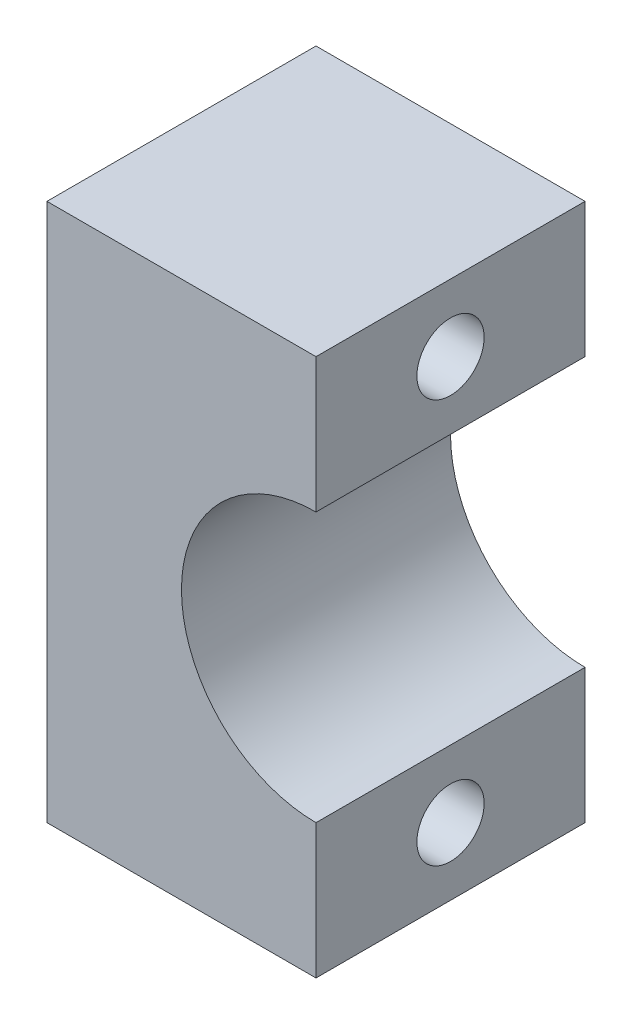
ISO-10303-21;
HEADER;
FILE_DESCRIPTION(('STEP AP214'),'2;1');
FILE_NAME('part.step','',(''),(''),'','','');
FILE_SCHEMA(('AUTOMOTIVE_DESIGN { 1 0 10303 214 1 1 1 1 }'));
ENDSEC;
DATA;
#1=APPLICATION_CONTEXT('core data for automotive mechanical design processes');
#2=APPLICATION_PROTOCOL_DEFINITION('international standard','automotive_design',2000,#1);
#3=PRODUCT_CONTEXT('',#1,'mechanical');
#4=PRODUCT('Part','Part','',(#3));
#5=PRODUCT_RELATED_PRODUCT_CATEGORY('part','',(#4));
#6=PRODUCT_DEFINITION_FORMATION('','',#4);
#7=PRODUCT_DEFINITION_CONTEXT('part definition',#1,'design');
#8=PRODUCT_DEFINITION('design','',#6,#7);
#9=PRODUCT_DEFINITION_SHAPE('','',#8);
#10=(LENGTH_UNIT() NAMED_UNIT(*) SI_UNIT(.MILLI.,.METRE.));
#11=(NAMED_UNIT(*) PLANE_ANGLE_UNIT() SI_UNIT($,.RADIAN.));
#12=(NAMED_UNIT(*) SI_UNIT($,.STERADIAN.) SOLID_ANGLE_UNIT());
#13=UNCERTAINTY_MEASURE_WITH_UNIT(LENGTH_MEASURE(1.E-05),#10,'distance_accuracy_value','');
#14=(GEOMETRIC_REPRESENTATION_CONTEXT(3) GLOBAL_UNCERTAINTY_ASSIGNED_CONTEXT((#13)) GLOBAL_UNIT_ASSIGNED_CONTEXT((#10,
#11,#12)) REPRESENTATION_CONTEXT('',''));
#15=CARTESIAN_POINT('',(0.,0.,0.));
#16=DIRECTION('',(0.,0.,1.));
#17=DIRECTION('',(1.,0.,0.));
#18=AXIS2_PLACEMENT_3D('',#15,#16,#17);
#19=CARTESIAN_POINT('',(-20.,20.,20.));
#20=DIRECTION('',(1.,0.,0.));
#21=DIRECTION('',(0.,0.,-1.));
#22=AXIS2_PLACEMENT_3D('',#19,#20,#21);
#23=PLANE('',#22);
#24=DIRECTION('',(0.,-1.,0.));
#25=VECTOR('',#24,1.);
#26=CARTESIAN_POINT('',(-20.,20.,0.));
#27=LINE('',#26,#25);
#28=CARTESIAN_POINT('',(-20.,20.,0.));
#29=VERTEX_POINT('',#28);
#30=CARTESIAN_POINT('',(-20.,-20.,0.));
#31=VERTEX_POINT('',#30);
#32=EDGE_CURVE('E127',#29,#31,#27,.T.);
#33=ORIENTED_EDGE('',*,*,#32,.T.);
#34=DIRECTION('',(0.,0.,-1.));
#35=VECTOR('',#34,1.);
#36=CARTESIAN_POINT('',(-20.,-20.,20.));
#37=LINE('',#36,#35);
#38=CARTESIAN_POINT('',(-20.,-20.,20.));
#39=VERTEX_POINT('',#38);
#40=EDGE_CURVE('E124',#39,#31,#37,.T.);
#41=ORIENTED_EDGE('',*,*,#40,.F.);
#42=DIRECTION('',(0.,-1.,0.));
#43=VECTOR('',#42,1.);
#44=CARTESIAN_POINT('',(-20.,20.,20.));
#45=LINE('',#44,#43);
#46=CARTESIAN_POINT('',(-20.,20.,20.));
#47=VERTEX_POINT('',#46);
#48=EDGE_CURVE('E110',#47,#39,#45,.T.);
#49=ORIENTED_EDGE('',*,*,#48,.F.);
#50=DIRECTION('',(0.,0.,-1.));
#51=VECTOR('',#50,1.);
#52=CARTESIAN_POINT('',(-20.,20.,20.));
#53=LINE('',#52,#51);
#54=EDGE_CURVE('E131',#47,#29,#53,.T.);
#55=ORIENTED_EDGE('',*,*,#54,.T.);
#56=EDGE_LOOP('',(#33,#41,#49,#55));
#57=FACE_BOUND('',#56,.T.);
#58=CARTESIAN_POINT('',(-20.,-15.,10.));
#59=DIRECTION('',(1.,0.,0.));
#60=DIRECTION('',(0.,0.,-1.));
#61=AXIS2_PLACEMENT_3D('',#58,#59,#60);
#62=CIRCLE('',#61,2.5);
#63=CARTESIAN_POINT('',(-20.,-15.,7.5));
#64=VERTEX_POINT('',#63);
#65=EDGE_CURVE('E189',#64,#64,#62,.T.);
#66=ORIENTED_EDGE('',*,*,#65,.T.);
#67=EDGE_LOOP('',(#66));
#68=FACE_BOUND('',#67,.T.);
#69=CARTESIAN_POINT('',(-20.,15.,10.));
#70=DIRECTION('',(1.,0.,0.));
#71=DIRECTION('',(0.,0.,-1.));
#72=AXIS2_PLACEMENT_3D('',#69,#70,#71);
#73=CIRCLE('',#72,2.5);
#74=CARTESIAN_POINT('',(-20.,15.,7.5));
#75=VERTEX_POINT('',#74);
#76=EDGE_CURVE('E147',#75,#75,#73,.T.);
#77=ORIENTED_EDGE('',*,*,#76,.T.);
#78=EDGE_LOOP('',(#77));
#79=FACE_BOUND('',#78,.T.);
#80=DIRECTION('',(0.,-1.,0.));
#81=VECTOR('',#80,1.);
#82=CARTESIAN_POINT('',(-20.,6.01054794666512,13.2604910584538));
#83=LINE('',#82,#81);
#84=CARTESIAN_POINT('',(-20.,6.01054794666512,13.2604910584538));
#85=VERTEX_POINT('',#84);
#86=CARTESIAN_POINT('',(-20.,-6.01054794666512,13.2604910584538));
#87=VERTEX_POINT('',#86);
#88=EDGE_CURVE('E56',#85,#87,#83,.T.);
#89=ORIENTED_EDGE('',*,*,#88,.T.);
#90=DIRECTION('',(0.,0.,-1.));
#91=VECTOR('',#90,1.);
#92=CARTESIAN_POINT('',(-20.,-6.01054794666512,6.73950894154617));
#93=LINE('',#92,#91);
#94=CARTESIAN_POINT('',(-20.,-6.01054794666512,6.73950894154617));
#95=VERTEX_POINT('',#94);
#96=EDGE_CURVE('E224',#87,#95,#93,.T.);
#97=ORIENTED_EDGE('',*,*,#96,.T.);
#98=DIRECTION('',(0.,1.,0.));
#99=VECTOR('',#98,1.);
#100=CARTESIAN_POINT('',(-20.,6.01054794666512,6.73950894154617));
#101=LINE('',#100,#99);
#102=CARTESIAN_POINT('',(-20.,6.01054794666512,6.73950894154617));
#103=VERTEX_POINT('',#102);
#104=EDGE_CURVE('E220',#95,#103,#101,.T.);
#105=ORIENTED_EDGE('',*,*,#104,.T.);
#106=DIRECTION('',(0.,0.,1.));
#107=VECTOR('',#106,1.);
#108=CARTESIAN_POINT('',(-20.,6.01054794666512,6.73950894154617));
#109=LINE('',#108,#107);
#110=EDGE_CURVE('E215',#103,#85,#109,.T.);
#111=ORIENTED_EDGE('',*,*,#110,.T.);
#112=EDGE_LOOP('',(#89,#97,#105,#111));
#113=FACE_BOUND('',#112,.T.);
#114=ADVANCED_FACE('F39',(#57,#68,#79,#113),#23,.F.);
#115=CARTESIAN_POINT('',(0.,0.,20.));
#116=DIRECTION('',(0.,0.,-1.));
#117=DIRECTION('',(-1.,0.,0.));
#118=AXIS2_PLACEMENT_3D('',#115,#116,#117);
#119=CYLINDRICAL_SURFACE('',#118,10.);
#120=CARTESIAN_POINT('',(0.,0.,0.));
#121=DIRECTION('',(0.,0.,-1.));
#122=DIRECTION('',(1.,0.,0.));
#123=AXIS2_PLACEMENT_3D('',#120,#121,#122);
#124=CIRCLE('',#123,10.);
#125=CARTESIAN_POINT('',(0.,-10.,0.));
#126=VERTEX_POINT('',#125);
#127=CARTESIAN_POINT('',(0.,10.,0.));
#128=VERTEX_POINT('',#127);
#129=EDGE_CURVE('E142',#126,#128,#124,.T.);
#130=ORIENTED_EDGE('',*,*,#129,.T.);
#131=DIRECTION('',(0.,0.,-1.));
#132=VECTOR('',#131,1.);
#133=CARTESIAN_POINT('',(0.,10.,20.));
#134=LINE('',#133,#132);
#135=CARTESIAN_POINT('',(0.,10.,20.));
#136=VERTEX_POINT('',#135);
#137=EDGE_CURVE('E11',#136,#128,#134,.T.);
#138=ORIENTED_EDGE('',*,*,#137,.F.);
#139=CARTESIAN_POINT('',(0.,0.,20.));
#140=DIRECTION('',(0.,0.,-1.));
#141=DIRECTION('',(1.,0.,0.));
#142=AXIS2_PLACEMENT_3D('',#139,#140,#141);
#143=CIRCLE('',#142,10.);
#144=CARTESIAN_POINT('',(0.,-10.,20.));
#145=VERTEX_POINT('',#144);
#146=EDGE_CURVE('E160',#145,#136,#143,.T.);
#147=ORIENTED_EDGE('',*,*,#146,.F.);
#148=DIRECTION('',(0.,0.,-1.));
#149=VECTOR('',#148,1.);
#150=CARTESIAN_POINT('',(0.,-10.,20.));
#151=LINE('',#150,#149);
#152=EDGE_CURVE('E138',#145,#126,#151,.T.);
#153=ORIENTED_EDGE('',*,*,#152,.T.);
#154=EDGE_LOOP('',(#130,#138,#147,#153));
#155=FACE_BOUND('',#154,.T.);
#156=ADVANCED_FACE('F41',(#155),#119,.F.);
#157=CARTESIAN_POINT('',(0.,20.,20.));
#158=DIRECTION('',(-1.,0.,0.));
#159=DIRECTION('',(0.,0.,1.));
#160=AXIS2_PLACEMENT_3D('',#157,#158,#159);
#161=PLANE('',#160);
#162=CARTESIAN_POINT('',(0.,15.,10.));
#163=DIRECTION('',(1.,0.,0.));
#164=DIRECTION('',(0.,0.,-1.));
#165=AXIS2_PLACEMENT_3D('',#162,#163,#164);
#166=CIRCLE('',#165,2.5);
#167=CARTESIAN_POINT('',(0.,15.,7.5));
#168=VERTEX_POINT('',#167);
#169=EDGE_CURVE('E194',#168,#168,#166,.T.);
#170=ORIENTED_EDGE('',*,*,#169,.F.);
#171=EDGE_LOOP('',(#170));
#172=FACE_BOUND('',#171,.T.);
#173=DIRECTION('',(0.,1.,0.));
#174=VECTOR('',#173,1.);
#175=CARTESIAN_POINT('',(0.,20.,0.));
#176=LINE('',#175,#174);
#177=CARTESIAN_POINT('',(0.,20.,0.));
#178=VERTEX_POINT('',#177);
#179=EDGE_CURVE('E146',#128,#178,#176,.T.);
#180=ORIENTED_EDGE('',*,*,#179,.T.);
#181=DIRECTION('',(0.,0.,-1.));
#182=VECTOR('',#181,1.);
#183=CARTESIAN_POINT('',(0.,20.,20.));
#184=LINE('',#183,#182);
#185=CARTESIAN_POINT('',(0.,20.,20.));
#186=VERTEX_POINT('',#185);
#187=EDGE_CURVE('E49',#186,#178,#184,.T.);
#188=ORIENTED_EDGE('',*,*,#187,.F.);
#189=DIRECTION('',(0.,1.,0.));
#190=VECTOR('',#189,1.);
#191=CARTESIAN_POINT('',(0.,20.,20.));
#192=LINE('',#191,#190);
#193=EDGE_CURVE('E100',#136,#186,#192,.T.);
#194=ORIENTED_EDGE('',*,*,#193,.F.);
#195=ORIENTED_EDGE('',*,*,#137,.T.);
#196=EDGE_LOOP('',(#180,#188,#194,#195));
#197=FACE_BOUND('',#196,.T.);
#198=ADVANCED_FACE('F272',(#172,#197),#161,.F.);
#199=CARTESIAN_POINT('',(-20.,20.,20.));
#200=DIRECTION('',(0.,-1.,0.));
#201=DIRECTION('',(0.,0.,-1.));
#202=AXIS2_PLACEMENT_3D('',#199,#200,#201);
#203=PLANE('',#202);
#204=DIRECTION('',(-1.,0.,0.));
#205=VECTOR('',#204,1.);
#206=CARTESIAN_POINT('',(-20.,20.,0.));
#207=LINE('',#206,#205);
#208=EDGE_CURVE('E150',#178,#29,#207,.T.);
#209=ORIENTED_EDGE('',*,*,#208,.T.);
#210=ORIENTED_EDGE('',*,*,#54,.F.);
#211=DIRECTION('',(-1.,0.,0.));
#212=VECTOR('',#211,1.);
#213=CARTESIAN_POINT('',(-20.,20.,20.));
#214=LINE('',#213,#212);
#215=EDGE_CURVE('E117',#186,#47,#214,.T.);
#216=ORIENTED_EDGE('',*,*,#215,.F.);
#217=ORIENTED_EDGE('',*,*,#187,.T.);
#218=EDGE_LOOP('',(#209,#210,#216,#217));
#219=FACE_BOUND('',#218,.T.);
#220=ADVANCED_FACE('F171',(#219),#203,.F.);
#221=CARTESIAN_POINT('',(-20.,-20.,20.));
#222=DIRECTION('',(0.,1.,0.));
#223=DIRECTION('',(0.,0.,1.));
#224=AXIS2_PLACEMENT_3D('',#221,#222,#223);
#225=PLANE('',#224);
#226=DIRECTION('',(1.,0.,0.));
#227=VECTOR('',#226,1.);
#228=CARTESIAN_POINT('',(-20.,-20.,0.));
#229=LINE('',#228,#227);
#230=CARTESIAN_POINT('',(0.,-20.,0.));
#231=VERTEX_POINT('',#230);
#232=EDGE_CURVE('E155',#31,#231,#229,.T.);
#233=ORIENTED_EDGE('',*,*,#232,.T.);
#234=DIRECTION('',(0.,0.,-1.));
#235=VECTOR('',#234,1.);
#236=CARTESIAN_POINT('',(0.,-20.,20.));
#237=LINE('',#236,#235);
#238=CARTESIAN_POINT('',(0.,-20.,20.));
#239=VERTEX_POINT('',#238);
#240=EDGE_CURVE('E132',#239,#231,#237,.T.);
#241=ORIENTED_EDGE('',*,*,#240,.F.);
#242=DIRECTION('',(1.,0.,0.));
#243=VECTOR('',#242,1.);
#244=CARTESIAN_POINT('',(-20.,-20.,20.));
#245=LINE('',#244,#243);
#246=EDGE_CURVE('E114',#39,#239,#245,.T.);
#247=ORIENTED_EDGE('',*,*,#246,.F.);
#248=ORIENTED_EDGE('',*,*,#40,.T.);
#249=EDGE_LOOP('',(#233,#241,#247,#248));
#250=FACE_BOUND('',#249,.T.);
#251=ADVANCED_FACE('F134',(#250),#225,.F.);
#252=CARTESIAN_POINT('',(0.,-10.,20.));
#253=DIRECTION('',(-1.,0.,0.));
#254=DIRECTION('',(0.,0.,1.));
#255=AXIS2_PLACEMENT_3D('',#252,#253,#254);
#256=PLANE('',#255);
#257=CARTESIAN_POINT('',(0.,-15.,10.));
#258=DIRECTION('',(1.,0.,0.));
#259=DIRECTION('',(0.,0.,-1.));
#260=AXIS2_PLACEMENT_3D('',#257,#258,#259);
#261=CIRCLE('',#260,2.5);
#262=CARTESIAN_POINT('',(0.,-15.,7.5));
#263=VERTEX_POINT('',#262);
#264=EDGE_CURVE('E184',#263,#263,#261,.T.);
#265=ORIENTED_EDGE('',*,*,#264,.F.);
#266=EDGE_LOOP('',(#265));
#267=FACE_BOUND('',#266,.T.);
#268=DIRECTION('',(0.,1.,0.));
#269=VECTOR('',#268,1.);
#270=CARTESIAN_POINT('',(0.,-10.,0.));
#271=LINE('',#270,#269);
#272=EDGE_CURVE('E92',#231,#126,#271,.T.);
#273=ORIENTED_EDGE('',*,*,#272,.T.);
#274=ORIENTED_EDGE('',*,*,#152,.F.);
#275=DIRECTION('',(0.,1.,0.));
#276=VECTOR('',#275,1.);
#277=CARTESIAN_POINT('',(0.,-10.,20.));
#278=LINE('',#277,#276);
#279=EDGE_CURVE('E65',#239,#145,#278,.T.);
#280=ORIENTED_EDGE('',*,*,#279,.F.);
#281=ORIENTED_EDGE('',*,*,#240,.T.);
#282=EDGE_LOOP('',(#273,#274,#280,#281));
#283=FACE_BOUND('',#282,.T.);
#284=ADVANCED_FACE('F175',(#267,#283),#256,.F.);
#285=CARTESIAN_POINT('',(0.,0.,20.));
#286=DIRECTION('',(0.,0.,1.));
#287=DIRECTION('',(1.,0.,0.));
#288=AXIS2_PLACEMENT_3D('',#285,#286,#287);
#289=PLANE('',#288);
#290=ORIENTED_EDGE('',*,*,#146,.T.);
#291=ORIENTED_EDGE('',*,*,#193,.T.);
#292=ORIENTED_EDGE('',*,*,#215,.T.);
#293=ORIENTED_EDGE('',*,*,#48,.T.);
#294=ORIENTED_EDGE('',*,*,#246,.T.);
#295=ORIENTED_EDGE('',*,*,#279,.T.);
#296=EDGE_LOOP('',(#290,#291,#292,#293,#294,#295));
#297=FACE_BOUND('',#296,.T.);
#298=ADVANCED_FACE('F112',(#297),#289,.T.);
#299=CARTESIAN_POINT('',(0.,0.,0.));
#300=DIRECTION('',(0.,0.,1.));
#301=DIRECTION('',(1.,0.,0.));
#302=AXIS2_PLACEMENT_3D('',#299,#300,#301);
#303=PLANE('',#302);
#304=CARTESIAN_POINT('',(-16.577606786142,0.,0.));
#305=DIRECTION('',(0.,0.,1.));
#306=DIRECTION('',(1.,0.,0.));
#307=AXIS2_PLACEMENT_3D('',#304,#305,#306);
#308=CIRCLE('',#307,1.);
#309=CARTESIAN_POINT('',(-15.577606786142,0.,0.));
#310=VERTEX_POINT('',#309);
#311=EDGE_CURVE('E244',#310,#310,#308,.T.);
#312=ORIENTED_EDGE('',*,*,#311,.T.);
#313=EDGE_LOOP('',(#312));
#314=FACE_BOUND('',#313,.T.);
#315=ORIENTED_EDGE('',*,*,#129,.F.);
#316=ORIENTED_EDGE('',*,*,#272,.F.);
#317=ORIENTED_EDGE('',*,*,#232,.F.);
#318=ORIENTED_EDGE('',*,*,#32,.F.);
#319=ORIENTED_EDGE('',*,*,#208,.F.);
#320=ORIENTED_EDGE('',*,*,#179,.F.);
#321=EDGE_LOOP('',(#315,#316,#317,#318,#319,#320));
#322=FACE_BOUND('',#321,.T.);
#323=ADVANCED_FACE('F174',(#314,#322),#303,.F.);
#324=CARTESIAN_POINT('',(-20.,-15.,10.));
#325=DIRECTION('',(1.,0.,0.));
#326=DIRECTION('',(0.,0.,-1.));
#327=AXIS2_PLACEMENT_3D('',#324,#325,#326);
#328=CYLINDRICAL_SURFACE('',#327,2.5);
#329=ORIENTED_EDGE('',*,*,#65,.F.);
#330=EDGE_LOOP('',(#329));
#331=FACE_BOUND('',#330,.T.);
#332=ORIENTED_EDGE('',*,*,#264,.T.);
#333=EDGE_LOOP('',(#332));
#334=FACE_BOUND('',#333,.T.);
#335=ADVANCED_FACE('F286',(#331,#334),#328,.F.);
#336=CARTESIAN_POINT('',(-20.,15.,10.));
#337=DIRECTION('',(1.,0.,0.));
#338=DIRECTION('',(0.,0.,-1.));
#339=AXIS2_PLACEMENT_3D('',#336,#337,#338);
#340=CYLINDRICAL_SURFACE('',#339,2.5);
#341=ORIENTED_EDGE('',*,*,#76,.F.);
#342=EDGE_LOOP('',(#341));
#343=FACE_BOUND('',#342,.T.);
#344=ORIENTED_EDGE('',*,*,#169,.T.);
#345=EDGE_LOOP('',(#344));
#346=FACE_BOUND('',#345,.T.);
#347=ADVANCED_FACE('F283',(#343,#346),#340,.F.);
#348=CARTESIAN_POINT('',(-15.,6.01054794666512,13.2604910584538));
#349=DIRECTION('',(0.,0.,-1.));
#350=DIRECTION('',(-1.,0.,0.));
#351=AXIS2_PLACEMENT_3D('',#348,#349,#350);
#352=PLANE('',#351);
#353=ORIENTED_EDGE('',*,*,#88,.F.);
#354=DIRECTION('',(-1.,0.,0.));
#355=VECTOR('',#354,1.);
#356=CARTESIAN_POINT('',(-15.,6.01054794666512,13.2604910584538));
#357=LINE('',#356,#355);
#358=CARTESIAN_POINT('',(-15.,6.01054794666512,13.2604910584538));
#359=VERTEX_POINT('',#358);
#360=EDGE_CURVE('E211',#359,#85,#357,.T.);
#361=ORIENTED_EDGE('',*,*,#360,.F.);
#362=DIRECTION('',(0.,-1.,0.));
#363=VECTOR('',#362,1.);
#364=CARTESIAN_POINT('',(-15.,6.01054794666512,13.2604910584538));
#365=LINE('',#364,#363);
#366=CARTESIAN_POINT('',(-15.,-6.01054794666512,13.2604910584538));
#367=VERTEX_POINT('',#366);
#368=EDGE_CURVE('E219',#359,#367,#365,.T.);
#369=ORIENTED_EDGE('',*,*,#368,.T.);
#370=DIRECTION('',(-1.,0.,0.));
#371=VECTOR('',#370,1.);
#372=CARTESIAN_POINT('',(-15.,-6.01054794666512,13.2604910584538));
#373=LINE('',#372,#371);
#374=EDGE_CURVE('E190',#367,#87,#373,.T.);
#375=ORIENTED_EDGE('',*,*,#374,.T.);
#376=EDGE_LOOP('',(#353,#361,#369,#375));
#377=FACE_BOUND('',#376,.T.);
#378=ADVANCED_FACE('F285',(#377),#352,.T.);
#379=CARTESIAN_POINT('',(-15.,-6.01054794666512,6.73950894154617));
#380=DIRECTION('',(0.,1.,0.));
#381=DIRECTION('',(0.,0.,1.));
#382=AXIS2_PLACEMENT_3D('',#379,#380,#381);
#383=PLANE('',#382);
#384=ORIENTED_EDGE('',*,*,#96,.F.);
#385=ORIENTED_EDGE('',*,*,#374,.F.);
#386=DIRECTION('',(0.,0.,-1.));
#387=VECTOR('',#386,1.);
#388=CARTESIAN_POINT('',(-15.,-6.01054794666512,6.73950894154617));
#389=LINE('',#388,#387);
#390=CARTESIAN_POINT('',(-15.,-6.01054794666512,6.73950894154617));
#391=VERTEX_POINT('',#390);
#392=EDGE_CURVE('E237',#367,#391,#389,.T.);
#393=ORIENTED_EDGE('',*,*,#392,.T.);
#394=DIRECTION('',(-1.,0.,0.));
#395=VECTOR('',#394,1.);
#396=CARTESIAN_POINT('',(-15.,-6.01054794666512,6.73950894154617));
#397=LINE('',#396,#395);
#398=EDGE_CURVE('E203',#391,#95,#397,.T.);
#399=ORIENTED_EDGE('',*,*,#398,.T.);
#400=EDGE_LOOP('',(#384,#385,#393,#399));
#401=FACE_BOUND('',#400,.T.);
#402=ADVANCED_FACE('F293',(#401),#383,.T.);
#403=CARTESIAN_POINT('',(-15.,6.01054794666512,6.73950894154617));
#404=DIRECTION('',(0.,0.,1.));
#405=DIRECTION('',(1.,0.,0.));
#406=AXIS2_PLACEMENT_3D('',#403,#404,#405);
#407=PLANE('',#406);
#408=CARTESIAN_POINT('',(-16.577606786142,0.,6.73950894154617));
#409=DIRECTION('',(0.,0.,1.));
#410=DIRECTION('',(1.,0.,0.));
#411=AXIS2_PLACEMENT_3D('',#408,#409,#410);
#412=CIRCLE('',#411,1.);
#413=CARTESIAN_POINT('',(-15.577606786142,0.,6.73950894154617));
#414=VERTEX_POINT('',#413);
#415=EDGE_CURVE('E43',#414,#414,#412,.F.);
#416=ORIENTED_EDGE('',*,*,#415,.T.);
#417=EDGE_LOOP('',(#416));
#418=FACE_BOUND('',#417,.T.);
#419=ORIENTED_EDGE('',*,*,#104,.F.);
#420=ORIENTED_EDGE('',*,*,#398,.F.);
#421=DIRECTION('',(0.,1.,0.));
#422=VECTOR('',#421,1.);
#423=CARTESIAN_POINT('',(-15.,6.01054794666512,6.73950894154617));
#424=LINE('',#423,#422);
#425=CARTESIAN_POINT('',(-15.,6.01054794666512,6.73950894154617));
#426=VERTEX_POINT('',#425);
#427=EDGE_CURVE('E233',#391,#426,#424,.T.);
#428=ORIENTED_EDGE('',*,*,#427,.T.);
#429=DIRECTION('',(-1.,0.,0.));
#430=VECTOR('',#429,1.);
#431=CARTESIAN_POINT('',(-15.,6.01054794666512,6.73950894154617));
#432=LINE('',#431,#430);
#433=EDGE_CURVE('E207',#426,#103,#432,.T.);
#434=ORIENTED_EDGE('',*,*,#433,.T.);
#435=EDGE_LOOP('',(#419,#420,#428,#434));
#436=FACE_BOUND('',#435,.T.);
#437=ADVANCED_FACE('F253',(#418,#436),#407,.T.);
#438=CARTESIAN_POINT('',(-15.,6.01054794666512,6.73950894154617));
#439=DIRECTION('',(0.,-1.,0.));
#440=DIRECTION('',(0.,0.,-1.));
#441=AXIS2_PLACEMENT_3D('',#438,#439,#440);
#442=PLANE('',#441);
#443=ORIENTED_EDGE('',*,*,#110,.F.);
#444=ORIENTED_EDGE('',*,*,#433,.F.);
#445=DIRECTION('',(0.,0.,1.));
#446=VECTOR('',#445,1.);
#447=CARTESIAN_POINT('',(-15.,6.01054794666512,6.73950894154617));
#448=LINE('',#447,#446);
#449=EDGE_CURVE('E214',#426,#359,#448,.T.);
#450=ORIENTED_EDGE('',*,*,#449,.T.);
#451=ORIENTED_EDGE('',*,*,#360,.T.);
#452=EDGE_LOOP('',(#443,#444,#450,#451));
#453=FACE_BOUND('',#452,.T.);
#454=ADVANCED_FACE('F264',(#453),#442,.T.);
#455=CARTESIAN_POINT('',(-15.,0.,0.));
#456=DIRECTION('',(-1.,0.,0.));
#457=DIRECTION('',(0.,0.,1.));
#458=AXIS2_PLACEMENT_3D('',#455,#456,#457);
#459=PLANE('',#458);
#460=ORIENTED_EDGE('',*,*,#368,.F.);
#461=ORIENTED_EDGE('',*,*,#449,.F.);
#462=ORIENTED_EDGE('',*,*,#427,.F.);
#463=ORIENTED_EDGE('',*,*,#392,.F.);
#464=EDGE_LOOP('',(#460,#461,#462,#463));
#465=FACE_BOUND('',#464,.T.);
#466=ADVANCED_FACE('F259',(#465),#459,.T.);
#467=CARTESIAN_POINT('',(-16.577606786142,0.,7.));
#468=DIRECTION('',(0.,0.,-1.));
#469=DIRECTION('',(-1.,0.,0.));
#470=AXIS2_PLACEMENT_3D('',#467,#468,#469);
#471=CYLINDRICAL_SURFACE('',#470,1.);
#472=ORIENTED_EDGE('',*,*,#415,.F.);
#473=EDGE_LOOP('',(#472));
#474=FACE_BOUND('',#473,.T.);
#475=ORIENTED_EDGE('',*,*,#311,.F.);
#476=EDGE_LOOP('',(#475));
#477=FACE_BOUND('',#476,.T.);
#478=ADVANCED_FACE('F256',(#474,#477),#471,.F.);
#479=CLOSED_SHELL('',(#114,#156,#198,#220,#251,#284,#298,#323,#335,#347,#378,#402,#437,#454,
#466,#478));
#480=MANIFOLD_SOLID_BREP('B2',#479);
#481=ADVANCED_BREP_SHAPE_REPRESENTATION('',(#18,#480),#14);
#482=SHAPE_DEFINITION_REPRESENTATION(#9,#481);
ENDSEC;
END-ISO-10303-21;
